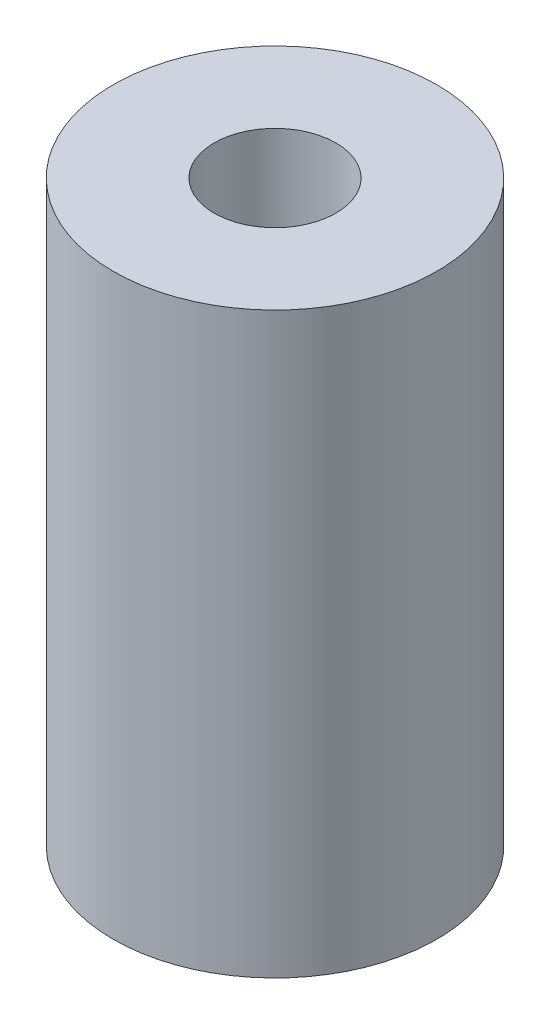
ISO-10303-21;
HEADER;
FILE_DESCRIPTION(('STEP AP214'),'2;1');
FILE_NAME('part.step','',(''),(''),'','','');
FILE_SCHEMA(('AUTOMOTIVE_DESIGN { 1 0 10303 214 1 1 1 1 }'));
ENDSEC;
DATA;
#1=APPLICATION_CONTEXT('core data for automotive mechanical design processes');
#2=APPLICATION_PROTOCOL_DEFINITION('international standard','automotive_design',2000,#1);
#3=PRODUCT_CONTEXT('',#1,'mechanical');
#4=PRODUCT('Part','Part','',(#3));
#5=PRODUCT_RELATED_PRODUCT_CATEGORY('part','',(#4));
#6=PRODUCT_DEFINITION_FORMATION('','',#4);
#7=PRODUCT_DEFINITION_CONTEXT('part definition',#1,'design');
#8=PRODUCT_DEFINITION('design','',#6,#7);
#9=PRODUCT_DEFINITION_SHAPE('','',#8);
#10=(LENGTH_UNIT() NAMED_UNIT(*) SI_UNIT(.MILLI.,.METRE.));
#11=(NAMED_UNIT(*) PLANE_ANGLE_UNIT() SI_UNIT($,.RADIAN.));
#12=(NAMED_UNIT(*) SI_UNIT($,.STERADIAN.) SOLID_ANGLE_UNIT());
#13=UNCERTAINTY_MEASURE_WITH_UNIT(LENGTH_MEASURE(1.E-05),#10,'distance_accuracy_value','');
#14=(GEOMETRIC_REPRESENTATION_CONTEXT(3) GLOBAL_UNCERTAINTY_ASSIGNED_CONTEXT((#13)) GLOBAL_UNIT_ASSIGNED_CONTEXT((#10,
#11,#12)) REPRESENTATION_CONTEXT('',''));
#15=CARTESIAN_POINT('',(0.,0.,0.));
#16=DIRECTION('',(0.,0.,1.));
#17=DIRECTION('',(1.,0.,0.));
#18=AXIS2_PLACEMENT_3D('',#15,#16,#17);
#19=CARTESIAN_POINT('',(0.,152.4,0.));
#20=DIRECTION('',(0.,1.,0.));
#21=DIRECTION('',(0.,0.,1.));
#22=AXIS2_PLACEMENT_3D('',#19,#20,#21);
#23=PLANE('',#22);
#24=CARTESIAN_POINT('',(0.,152.4,0.));
#25=DIRECTION('',(0.,1.,0.));
#26=DIRECTION('',(0.,0.,1.));
#27=AXIS2_PLACEMENT_3D('',#24,#25,#26);
#28=CIRCLE('',#27,42.6085);
#29=CARTESIAN_POINT('',(0.,152.4,-42.6085000000002));
#30=VERTEX_POINT('',#29);
#31=EDGE_CURVE('E10',#30,#30,#28,.T.);
#32=ORIENTED_EDGE('',*,*,#31,.T.);
#33=EDGE_LOOP('',(#32));
#34=FACE_BOUND('',#33,.T.);
#35=CARTESIAN_POINT('',(0.,152.4,0.));
#36=DIRECTION('',(0.,1.,0.));
#37=DIRECTION('',(0.,0.,1.));
#38=AXIS2_PLACEMENT_3D('',#35,#36,#37);
#39=CIRCLE('',#38,16.0401);
#40=CARTESIAN_POINT('',(0.,152.4,-16.0401000000001));
#41=VERTEX_POINT('',#40);
#42=EDGE_CURVE('E45',#41,#41,#39,.T.);
#43=ORIENTED_EDGE('',*,*,#42,.F.);
#44=EDGE_LOOP('',(#43));
#45=FACE_BOUND('',#44,.T.);
#46=ADVANCED_FACE('F31',(#34,#45),#23,.T.);
#47=CARTESIAN_POINT('',(0.,0.,0.));
#48=DIRECTION('',(0.,1.,0.));
#49=DIRECTION('',(0.,0.,1.));
#50=AXIS2_PLACEMENT_3D('',#47,#48,#49);
#51=PLANE('',#50);
#52=CARTESIAN_POINT('',(0.,0.,0.));
#53=DIRECTION('',(0.,1.,0.));
#54=DIRECTION('',(0.,0.,1.));
#55=AXIS2_PLACEMENT_3D('',#52,#53,#54);
#56=CIRCLE('',#55,42.6085);
#57=CARTESIAN_POINT('',(0.,0.,-42.6085000000002));
#58=VERTEX_POINT('',#57);
#59=EDGE_CURVE('E35',#58,#58,#56,.T.);
#60=ORIENTED_EDGE('',*,*,#59,.F.);
#61=EDGE_LOOP('',(#60));
#62=FACE_BOUND('',#61,.T.);
#63=CARTESIAN_POINT('',(0.,0.,0.));
#64=DIRECTION('',(0.,1.,0.));
#65=DIRECTION('',(0.,0.,1.));
#66=AXIS2_PLACEMENT_3D('',#63,#64,#65);
#67=CIRCLE('',#66,16.0401);
#68=CARTESIAN_POINT('',(0.,0.,-16.0401000000001));
#69=VERTEX_POINT('',#68);
#70=EDGE_CURVE('E47',#69,#69,#67,.T.);
#71=ORIENTED_EDGE('',*,*,#70,.T.);
#72=EDGE_LOOP('',(#71));
#73=FACE_BOUND('',#72,.T.);
#74=ADVANCED_FACE('F58',(#62,#73),#51,.F.);
#75=CARTESIAN_POINT('',(0.,152.4,0.));
#76=DIRECTION('',(0.,-1.,0.));
#77=DIRECTION('',(0.,0.,-1.));
#78=AXIS2_PLACEMENT_3D('',#75,#76,#77);
#79=CYLINDRICAL_SURFACE('',#78,42.6085);
#80=CARTESIAN_POINT('',(0.,152.4,-42.6085000000002));
#81=CARTESIAN_POINT('',(0.,150.8125,-42.6085000000002));
#82=CARTESIAN_POINT('',(0.,149.225,-42.6085000000002));
#83=CARTESIAN_POINT('',(0.,146.05,-42.6085000000002));
#84=CARTESIAN_POINT('',(0.,144.4625,-42.6085000000002));
#85=CARTESIAN_POINT('',(0.,141.2875,-42.6085000000002));
#86=CARTESIAN_POINT('',(0.,139.7,-42.6085000000002));
#87=CARTESIAN_POINT('',(0.,136.525,-42.6085000000002));
#88=CARTESIAN_POINT('',(0.,134.9375,-42.6085000000002));
#89=CARTESIAN_POINT('',(0.,131.7625,-42.6085000000002));
#90=CARTESIAN_POINT('',(0.,130.175,-42.6085000000002));
#91=CARTESIAN_POINT('',(0.,127.,-42.6085000000002));
#92=CARTESIAN_POINT('',(0.,125.4125,-42.6085000000002));
#93=CARTESIAN_POINT('',(0.,122.2375,-42.6085000000002));
#94=CARTESIAN_POINT('',(0.,120.65,-42.6085000000002));
#95=CARTESIAN_POINT('',(0.,117.475,-42.6085000000002));
#96=CARTESIAN_POINT('',(0.,115.8875,-42.6085000000002));
#97=CARTESIAN_POINT('',(0.,112.7125,-42.6085000000002));
#98=CARTESIAN_POINT('',(0.,111.125,-42.6085000000002));
#99=CARTESIAN_POINT('',(0.,107.95,-42.6085000000002));
#100=CARTESIAN_POINT('',(0.,106.3625,-42.6085000000002));
#101=CARTESIAN_POINT('',(0.,103.1875,-42.6085000000002));
#102=CARTESIAN_POINT('',(0.,101.6,-42.6085000000002));
#103=CARTESIAN_POINT('',(0.,98.425,-42.6085000000002));
#104=CARTESIAN_POINT('',(0.,96.8375,-42.6085000000002));
#105=CARTESIAN_POINT('',(0.,93.6625,-42.6085000000002));
#106=CARTESIAN_POINT('',(0.,92.075,-42.6085000000002));
#107=CARTESIAN_POINT('',(0.,88.9,-42.6085000000002));
#108=CARTESIAN_POINT('',(0.,87.3125,-42.6085000000002));
#109=CARTESIAN_POINT('',(0.,84.1375,-42.6085000000002));
#110=CARTESIAN_POINT('',(0.,82.55,-42.6085000000002));
#111=CARTESIAN_POINT('',(0.,79.375,-42.6085000000002));
#112=CARTESIAN_POINT('',(0.,77.7875,-42.6085000000002));
#113=CARTESIAN_POINT('',(0.,74.6125,-42.6085000000002));
#114=CARTESIAN_POINT('',(0.,73.025,-42.6085000000002));
#115=CARTESIAN_POINT('',(0.,69.85,-42.6085000000002));
#116=CARTESIAN_POINT('',(0.,68.2625,-42.6085000000002));
#117=CARTESIAN_POINT('',(0.,65.0875,-42.6085000000002));
#118=CARTESIAN_POINT('',(0.,63.5,-42.6085000000002));
#119=CARTESIAN_POINT('',(0.,60.325,-42.6085000000002));
#120=CARTESIAN_POINT('',(0.,58.7375,-42.6085000000002));
#121=CARTESIAN_POINT('',(0.,55.5625,-42.6085000000002));
#122=CARTESIAN_POINT('',(0.,53.975,-42.6085000000002));
#123=CARTESIAN_POINT('',(0.,50.8,-42.6085000000002));
#124=CARTESIAN_POINT('',(0.,49.2125,-42.6085000000002));
#125=CARTESIAN_POINT('',(0.,46.0375,-42.6085000000002));
#126=CARTESIAN_POINT('',(0.,44.45,-42.6085000000002));
#127=CARTESIAN_POINT('',(0.,41.275,-42.6085000000002));
#128=CARTESIAN_POINT('',(0.,39.6875,-42.6085000000002));
#129=CARTESIAN_POINT('',(0.,36.5125,-42.6085000000002));
#130=CARTESIAN_POINT('',(0.,34.925,-42.6085000000002));
#131=CARTESIAN_POINT('',(0.,31.75,-42.6085000000002));
#132=CARTESIAN_POINT('',(0.,30.1625,-42.6085000000002));
#133=CARTESIAN_POINT('',(0.,26.9875,-42.6085000000002));
#134=CARTESIAN_POINT('',(0.,25.4,-42.6085000000002));
#135=CARTESIAN_POINT('',(0.,22.225,-42.6085000000002));
#136=CARTESIAN_POINT('',(0.,20.6375,-42.6085000000002));
#137=CARTESIAN_POINT('',(0.,17.4625,-42.6085000000002));
#138=CARTESIAN_POINT('',(0.,15.875,-42.6085000000002));
#139=CARTESIAN_POINT('',(0.,12.7,-42.6085000000002));
#140=CARTESIAN_POINT('',(0.,11.1125,-42.6085000000002));
#141=CARTESIAN_POINT('',(0.,7.93749999999998,-42.6085000000002));
#142=CARTESIAN_POINT('',(0.,6.34999999999998,-42.6085000000002));
#143=CARTESIAN_POINT('',(0.,3.17499999999997,-42.6085000000002));
#144=CARTESIAN_POINT('',(0.,1.58749999999997,-42.6085000000002));
#145=CARTESIAN_POINT('',(0.,0.,-42.6085000000002));
#146=B_SPLINE_CURVE_WITH_KNOTS('',3,(#80,#81,#82,#83,#84,#85,#86,#87,#88,#89,#90,#91,#92,#93,
#94,#95,#96,#97,#98,#99,#100,#101,#102,#103,#104,#105,#106,#107,#108,#109,#110,#111,#112,#113,
#114,#115,#116,#117,#118,#119,#120,#121,#122,#123,#124,#125,#126,#127,#128,#129,#130,#131,#132,
#133,#134,#135,#136,#137,#138,#139,#140,#141,#142,#143,#144,#145),.UNSPECIFIED.,.F.,.F.,(4,2,2,
2,2,2,2,2,2,2,2,2,2,2,2,2,2,2,2,2,2,2,2,2,2,2,2,2,2,2,2,2,4),(0.,4.76249999999998,
9.52499999999998,14.2875,19.05,23.8125,28.575,33.3375,38.1,42.8625,47.625,52.3875,57.15,61.9125,
66.675,71.4375,76.2,80.9625,85.725,90.4875,95.25,100.0125,104.775,109.5375,114.3,119.0625,
123.825,128.5875,133.35,138.1125,142.875,147.6375,152.4),.UNSPECIFIED.);
#147=EDGE_CURVE('BSEAM33',#30,#58,#146,.T.);
#148=ORIENTED_EDGE('',*,*,#31,.F.);
#149=ORIENTED_EDGE('',*,*,#59,.T.);
#150=ORIENTED_EDGE('',*,*,#147,.T.);
#151=ORIENTED_EDGE('',*,*,#147,.F.);
#152=EDGE_LOOP('',(#148,#150,#149,#151));
#153=FACE_BOUND('',#152,.T.);
#154=ADVANCED_FACE('F33',(#153),#79,.T.);
#155=CARTESIAN_POINT('',(0.,152.4,0.));
#156=DIRECTION('',(0.,-1.,0.));
#157=DIRECTION('',(0.,0.,-1.));
#158=AXIS2_PLACEMENT_3D('',#155,#156,#157);
#159=CYLINDRICAL_SURFACE('',#158,16.0401);
#160=CARTESIAN_POINT('',(0.,152.4,-16.0401000000001));
#161=CARTESIAN_POINT('',(0.,150.8125,-16.0401000000001));
#162=CARTESIAN_POINT('',(0.,149.225,-16.0401000000001));
#163=CARTESIAN_POINT('',(0.,146.05,-16.0401000000001));
#164=CARTESIAN_POINT('',(0.,144.4625,-16.0401000000001));
#165=CARTESIAN_POINT('',(0.,141.2875,-16.0401000000001));
#166=CARTESIAN_POINT('',(0.,139.7,-16.0401000000001));
#167=CARTESIAN_POINT('',(0.,136.525,-16.0401000000001));
#168=CARTESIAN_POINT('',(0.,134.9375,-16.0401000000001));
#169=CARTESIAN_POINT('',(0.,131.7625,-16.0401000000001));
#170=CARTESIAN_POINT('',(0.,130.175,-16.0401000000001));
#171=CARTESIAN_POINT('',(0.,127.,-16.0401000000001));
#172=CARTESIAN_POINT('',(0.,125.4125,-16.0401000000001));
#173=CARTESIAN_POINT('',(0.,122.2375,-16.0401000000001));
#174=CARTESIAN_POINT('',(0.,120.65,-16.0401000000001));
#175=CARTESIAN_POINT('',(0.,117.475,-16.0401000000001));
#176=CARTESIAN_POINT('',(0.,115.8875,-16.0401000000001));
#177=CARTESIAN_POINT('',(0.,112.7125,-16.0401000000001));
#178=CARTESIAN_POINT('',(0.,111.125,-16.0401000000001));
#179=CARTESIAN_POINT('',(0.,107.95,-16.0401000000001));
#180=CARTESIAN_POINT('',(0.,106.3625,-16.0401000000001));
#181=CARTESIAN_POINT('',(0.,103.1875,-16.0401000000001));
#182=CARTESIAN_POINT('',(0.,101.6,-16.0401000000001));
#183=CARTESIAN_POINT('',(0.,98.425,-16.0401000000001));
#184=CARTESIAN_POINT('',(0.,96.8375,-16.0401000000001));
#185=CARTESIAN_POINT('',(0.,93.6625,-16.0401000000001));
#186=CARTESIAN_POINT('',(0.,92.075,-16.0401000000001));
#187=CARTESIAN_POINT('',(0.,88.9,-16.0401000000001));
#188=CARTESIAN_POINT('',(0.,87.3125,-16.0401000000001));
#189=CARTESIAN_POINT('',(0.,84.1375,-16.0401000000001));
#190=CARTESIAN_POINT('',(0.,82.55,-16.0401000000001));
#191=CARTESIAN_POINT('',(0.,79.375,-16.0401000000001));
#192=CARTESIAN_POINT('',(0.,77.7875,-16.0401000000001));
#193=CARTESIAN_POINT('',(0.,74.6125,-16.0401000000001));
#194=CARTESIAN_POINT('',(0.,73.025,-16.0401000000001));
#195=CARTESIAN_POINT('',(0.,69.85,-16.0401000000001));
#196=CARTESIAN_POINT('',(0.,68.2625,-16.0401000000001));
#197=CARTESIAN_POINT('',(0.,65.0875,-16.0401000000001));
#198=CARTESIAN_POINT('',(0.,63.5,-16.0401000000001));
#199=CARTESIAN_POINT('',(0.,60.325,-16.0401000000001));
#200=CARTESIAN_POINT('',(0.,58.7375,-16.0401000000001));
#201=CARTESIAN_POINT('',(0.,55.5625,-16.0401000000001));
#202=CARTESIAN_POINT('',(0.,53.975,-16.0401000000001));
#203=CARTESIAN_POINT('',(0.,50.8,-16.0401000000001));
#204=CARTESIAN_POINT('',(0.,49.2125,-16.0401000000001));
#205=CARTESIAN_POINT('',(0.,46.0375,-16.0401000000001));
#206=CARTESIAN_POINT('',(0.,44.45,-16.0401000000001));
#207=CARTESIAN_POINT('',(0.,41.275,-16.0401000000001));
#208=CARTESIAN_POINT('',(0.,39.6875,-16.0401000000001));
#209=CARTESIAN_POINT('',(0.,36.5125,-16.0401000000001));
#210=CARTESIAN_POINT('',(0.,34.925,-16.0401000000001));
#211=CARTESIAN_POINT('',(0.,31.75,-16.0401000000001));
#212=CARTESIAN_POINT('',(0.,30.1625,-16.0401000000001));
#213=CARTESIAN_POINT('',(0.,26.9875,-16.0401000000001));
#214=CARTESIAN_POINT('',(0.,25.4,-16.0401000000001));
#215=CARTESIAN_POINT('',(0.,22.225,-16.0401000000001));
#216=CARTESIAN_POINT('',(0.,20.6375,-16.0401000000001));
#217=CARTESIAN_POINT('',(0.,17.4625,-16.0401000000001));
#218=CARTESIAN_POINT('',(0.,15.875,-16.0401000000001));
#219=CARTESIAN_POINT('',(0.,12.7,-16.0401000000001));
#220=CARTESIAN_POINT('',(0.,11.1125,-16.0401000000001));
#221=CARTESIAN_POINT('',(0.,7.93749999999998,-16.0401000000001));
#222=CARTESIAN_POINT('',(0.,6.34999999999998,-16.0401000000001));
#223=CARTESIAN_POINT('',(0.,3.17499999999997,-16.0401000000001));
#224=CARTESIAN_POINT('',(0.,1.58749999999997,-16.0401000000001));
#225=CARTESIAN_POINT('',(0.,0.,-16.0401000000001));
#226=B_SPLINE_CURVE_WITH_KNOTS('',3,(#160,#161,#162,#163,#164,#165,#166,#167,#168,#169,#170,
#171,#172,#173,#174,#175,#176,#177,#178,#179,#180,#181,#182,#183,#184,#185,#186,#187,#188,#189,
#190,#191,#192,#193,#194,#195,#196,#197,#198,#199,#200,#201,#202,#203,#204,#205,#206,#207,#208,
#209,#210,#211,#212,#213,#214,#215,#216,#217,#218,#219,#220,#221,#222,#223,#224,#225),
.UNSPECIFIED.,.F.,.F.,(4,2,2,2,2,2,2,2,2,2,2,2,2,2,2,2,2,2,2,2,2,2,2,2,2,2,2,2,2,2,2,2,4),(0.,
4.76249999999998,9.52499999999998,14.2875,19.05,23.8125,28.575,33.3375,38.1,42.8625,47.625,
52.3875,57.15,61.9125,66.675,71.4375,76.2,80.9625,85.725,90.4875,95.25,100.0125,104.775,
109.5375,114.3,119.0625,123.825,128.5875,133.35,138.1125,142.875,147.6375,152.4),.UNSPECIFIED.);
#227=EDGE_CURVE('BSEAM54',#41,#69,#226,.T.);
#228=ORIENTED_EDGE('',*,*,#42,.T.);
#229=ORIENTED_EDGE('',*,*,#70,.F.);
#230=ORIENTED_EDGE('',*,*,#227,.T.);
#231=ORIENTED_EDGE('',*,*,#227,.F.);
#232=EDGE_LOOP('',(#228,#230,#229,#231));
#233=FACE_BOUND('',#232,.T.);
#234=ADVANCED_FACE('F54',(#233),#159,.F.);
#235=CLOSED_SHELL('',(#46,#74,#154,#234));
#236=MANIFOLD_SOLID_BREP('B2',#235);
#237=ADVANCED_BREP_SHAPE_REPRESENTATION('',(#18,#236),#14);
#238=SHAPE_DEFINITION_REPRESENTATION(#9,#237);
ENDSEC;
END-ISO-10303-21;
